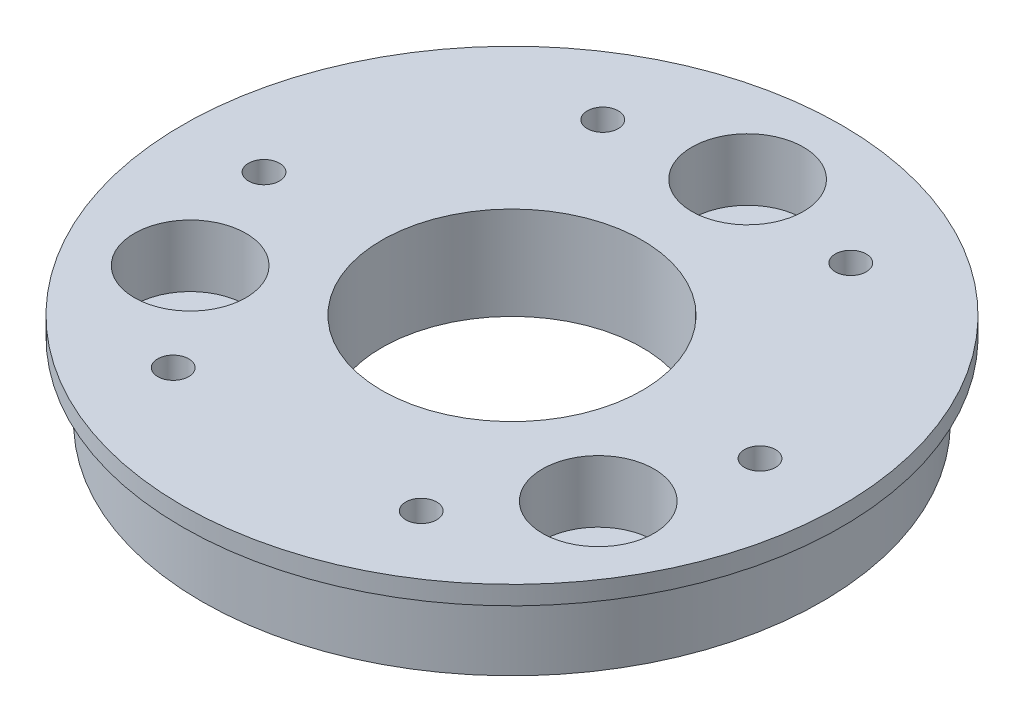
ISO-10303-21;
HEADER;
FILE_DESCRIPTION(('STEP AP214'),'2;1');
FILE_NAME('part.step','',(''),(''),'','','');
FILE_SCHEMA(('AUTOMOTIVE_DESIGN { 1 0 10303 214 1 1 1 1 }'));
ENDSEC;
DATA;
#1=APPLICATION_CONTEXT('core data for automotive mechanical design processes');
#2=APPLICATION_PROTOCOL_DEFINITION('international standard','automotive_design',2000,#1);
#3=PRODUCT_CONTEXT('',#1,'mechanical');
#4=PRODUCT('Part','Part','',(#3));
#5=PRODUCT_RELATED_PRODUCT_CATEGORY('part','',(#4));
#6=PRODUCT_DEFINITION_FORMATION('','',#4);
#7=PRODUCT_DEFINITION_CONTEXT('part definition',#1,'design');
#8=PRODUCT_DEFINITION('design','',#6,#7);
#9=PRODUCT_DEFINITION_SHAPE('','',#8);
#10=(LENGTH_UNIT() NAMED_UNIT(*) SI_UNIT(.MILLI.,.METRE.));
#11=(NAMED_UNIT(*) PLANE_ANGLE_UNIT() SI_UNIT($,.RADIAN.));
#12=(NAMED_UNIT(*) SI_UNIT($,.STERADIAN.) SOLID_ANGLE_UNIT());
#13=UNCERTAINTY_MEASURE_WITH_UNIT(LENGTH_MEASURE(1.E-05),#10,'distance_accuracy_value','');
#14=(GEOMETRIC_REPRESENTATION_CONTEXT(3) GLOBAL_UNCERTAINTY_ASSIGNED_CONTEXT((#13)) GLOBAL_UNIT_ASSIGNED_CONTEXT((#10,
#11,#12)) REPRESENTATION_CONTEXT('',''));
#15=CARTESIAN_POINT('',(0.,0.,0.));
#16=DIRECTION('',(0.,0.,1.));
#17=DIRECTION('',(1.,0.,0.));
#18=AXIS2_PLACEMENT_3D('',#15,#16,#17);
#19=CARTESIAN_POINT('',(16.4544826719043,0.,9.49999999999998));
#20=DIRECTION('',(0.,1.,0.));
#21=DIRECTION('',(0.,0.,1.));
#22=AXIS2_PLACEMENT_3D('',#19,#20,#21);
#23=CYLINDRICAL_SURFACE('',#22,2.5);
#24=CARTESIAN_POINT('',(16.4544826719043,0.,9.49999999999998));
#25=DIRECTION('',(0.,1.,0.));
#26=DIRECTION('',(0.,0.,1.));
#27=AXIS2_PLACEMENT_3D('',#24,#25,#26);
#28=CIRCLE('',#27,2.5);
#29=CARTESIAN_POINT('',(16.4544826719043,0.,12.));
#30=VERTEX_POINT('',#29);
#31=EDGE_CURVE('E139',#30,#30,#28,.T.);
#32=ORIENTED_EDGE('',*,*,#31,.F.);
#33=EDGE_LOOP('',(#32));
#34=FACE_BOUND('',#33,.T.);
#35=CARTESIAN_POINT('',(16.4544826719043,2.5,9.49999999999998));
#36=DIRECTION('',(0.,1.,0.));
#37=DIRECTION('',(0.,0.,1.));
#38=AXIS2_PLACEMENT_3D('',#35,#36,#37);
#39=CIRCLE('',#38,2.5);
#40=CARTESIAN_POINT('',(16.4544826719043,2.5,12.));
#41=VERTEX_POINT('',#40);
#42=EDGE_CURVE('E166',#41,#41,#39,.F.);
#43=ORIENTED_EDGE('',*,*,#42,.F.);
#44=EDGE_LOOP('',(#43));
#45=FACE_BOUND('',#44,.T.);
#46=ADVANCED_FACE('F44',(#34,#45),#23,.F.);
#47=CARTESIAN_POINT('',(-16.4544826719043,0.,9.49999999999998));
#48=DIRECTION('',(0.,1.,0.));
#49=DIRECTION('',(0.,0.,1.));
#50=AXIS2_PLACEMENT_3D('',#47,#48,#49);
#51=CYLINDRICAL_SURFACE('',#50,2.5);
#52=CARTESIAN_POINT('',(-16.4544826719043,0.,9.49999999999998));
#53=DIRECTION('',(0.,1.,0.));
#54=DIRECTION('',(0.,0.,1.));
#55=AXIS2_PLACEMENT_3D('',#52,#53,#54);
#56=CIRCLE('',#55,2.5);
#57=CARTESIAN_POINT('',(-16.4544826719043,0.,12.));
#58=VERTEX_POINT('',#57);
#59=EDGE_CURVE('E132',#58,#58,#56,.T.);
#60=ORIENTED_EDGE('',*,*,#59,.F.);
#61=EDGE_LOOP('',(#60));
#62=FACE_BOUND('',#61,.T.);
#63=CARTESIAN_POINT('',(-16.4544826719043,2.5,9.49999999999998));
#64=DIRECTION('',(0.,1.,0.));
#65=DIRECTION('',(0.,0.,1.));
#66=AXIS2_PLACEMENT_3D('',#63,#64,#65);
#67=CIRCLE('',#66,2.5);
#68=CARTESIAN_POINT('',(-16.4544826719043,2.5,12.));
#69=VERTEX_POINT('',#68);
#70=EDGE_CURVE('E161',#69,#69,#67,.F.);
#71=ORIENTED_EDGE('',*,*,#70,.F.);
#72=EDGE_LOOP('',(#71));
#73=FACE_BOUND('',#72,.T.);
#74=ADVANCED_FACE('F87',(#62,#73),#51,.F.);
#75=CARTESIAN_POINT('',(0.,0.,-19.));
#76=DIRECTION('',(0.,1.,0.));
#77=DIRECTION('',(0.,0.,1.));
#78=AXIS2_PLACEMENT_3D('',#75,#76,#77);
#79=CYLINDRICAL_SURFACE('',#78,2.5);
#80=CARTESIAN_POINT('',(0.,0.,-19.));
#81=DIRECTION('',(0.,1.,0.));
#82=DIRECTION('',(0.,0.,1.));
#83=AXIS2_PLACEMENT_3D('',#80,#81,#82);
#84=CIRCLE('',#83,2.5);
#85=CARTESIAN_POINT('',(0.,0.,-16.5));
#86=VERTEX_POINT('',#85);
#87=EDGE_CURVE('E124',#86,#86,#84,.T.);
#88=ORIENTED_EDGE('',*,*,#87,.F.);
#89=EDGE_LOOP('',(#88));
#90=FACE_BOUND('',#89,.T.);
#91=CARTESIAN_POINT('',(0.,2.5,-19.));
#92=DIRECTION('',(0.,1.,0.));
#93=DIRECTION('',(0.,0.,1.));
#94=AXIS2_PLACEMENT_3D('',#91,#92,#93);
#95=CIRCLE('',#94,2.5);
#96=CARTESIAN_POINT('',(0.,2.5,-16.5));
#97=VERTEX_POINT('',#96);
#98=EDGE_CURVE('E157',#97,#97,#95,.F.);
#99=ORIENTED_EDGE('',*,*,#98,.F.);
#100=EDGE_LOOP('',(#99));
#101=FACE_BOUND('',#100,.T.);
#102=ADVANCED_FACE('F93',(#90,#101),#79,.F.);
#103=CARTESIAN_POINT('',(20.,2.,0.));
#104=DIRECTION('',(0.,1.,0.));
#105=DIRECTION('',(0.,0.,1.));
#106=AXIS2_PLACEMENT_3D('',#103,#104,#105);
#107=CYLINDRICAL_SURFACE('',#106,1.25);
#108=CARTESIAN_POINT('',(20.,2.,0.));
#109=DIRECTION('',(0.,1.,0.));
#110=DIRECTION('',(0.,0.,1.));
#111=AXIS2_PLACEMENT_3D('',#108,#109,#110);
#112=CIRCLE('',#111,1.25);
#113=CARTESIAN_POINT('',(20.,2.,1.25));
#114=VERTEX_POINT('',#113);
#115=EDGE_CURVE('E264',#114,#114,#112,.T.);
#116=ORIENTED_EDGE('',*,*,#115,.F.);
#117=EDGE_LOOP('',(#116));
#118=FACE_BOUND('',#117,.T.);
#119=CARTESIAN_POINT('',(20.,7.5,0.));
#120=DIRECTION('',(0.,1.,0.));
#121=DIRECTION('',(0.,0.,1.));
#122=AXIS2_PLACEMENT_3D('',#119,#120,#121);
#123=CIRCLE('',#122,1.25);
#124=CARTESIAN_POINT('',(20.,7.5,1.25));
#125=VERTEX_POINT('',#124);
#126=EDGE_CURVE('E169',#125,#125,#123,.T.);
#127=ORIENTED_EDGE('',*,*,#126,.T.);
#128=EDGE_LOOP('',(#127));
#129=FACE_BOUND('',#128,.T.);
#130=ADVANCED_FACE('F351',(#118,#129),#107,.F.);
#131=CARTESIAN_POINT('',(20.,2.,0.));
#132=DIRECTION('',(0.,1.,0.));
#133=DIRECTION('',(0.,0.,1.));
#134=AXIS2_PLACEMENT_3D('',#131,#132,#133);
#135=PLANE('',#134);
#136=CARTESIAN_POINT('',(20.,2.,0.));
#137=DIRECTION('',(0.,1.,0.));
#138=DIRECTION('',(0.,0.,1.));
#139=AXIS2_PLACEMENT_3D('',#136,#137,#138);
#140=CIRCLE('',#139,0.417860258824741);
#141=CARTESIAN_POINT('',(20.,2.,0.417860258824741));
#142=VERTEX_POINT('',#141);
#143=EDGE_CURVE('E170',#142,#142,#140,.T.);
#144=ORIENTED_EDGE('',*,*,#143,.F.);
#145=EDGE_LOOP('',(#144));
#146=FACE_BOUND('',#145,.T.);
#147=ORIENTED_EDGE('',*,*,#115,.T.);
#148=EDGE_LOOP('',(#147));
#149=FACE_BOUND('',#148,.T.);
#150=ADVANCED_FACE('F353',(#146,#149),#135,.T.);
#151=CARTESIAN_POINT('',(0.,7.5,0.));
#152=DIRECTION('',(0.,-1.,0.));
#153=DIRECTION('',(0.,0.,-1.));
#154=AXIS2_PLACEMENT_3D('',#151,#152,#153);
#155=CYLINDRICAL_SURFACE('',#154,26.5766814637014);
#156=CARTESIAN_POINT('',(0.,7.5,0.));
#157=DIRECTION('',(0.,1.,0.));
#158=DIRECTION('',(0.,0.,1.));
#159=AXIS2_PLACEMENT_3D('',#156,#157,#158);
#160=CIRCLE('',#159,26.5766814637014);
#161=CARTESIAN_POINT('',(0.,7.5,26.5766814637014));
#162=VERTEX_POINT('',#161);
#163=EDGE_CURVE('E256',#162,#162,#160,.T.);
#164=ORIENTED_EDGE('',*,*,#163,.F.);
#165=EDGE_LOOP('',(#164));
#166=FACE_BOUND('',#165,.T.);
#167=CARTESIAN_POINT('',(0.,6.,0.));
#168=DIRECTION('',(0.,1.,0.));
#169=DIRECTION('',(0.,0.,1.));
#170=AXIS2_PLACEMENT_3D('',#167,#168,#169);
#171=CIRCLE('',#170,26.5766814637014);
#172=CARTESIAN_POINT('',(0.,6.,26.5766814637014));
#173=VERTEX_POINT('',#172);
#174=EDGE_CURVE('E255',#173,#173,#171,.T.);
#175=ORIENTED_EDGE('',*,*,#174,.T.);
#176=EDGE_LOOP('',(#175));
#177=FACE_BOUND('',#176,.T.);
#178=ADVANCED_FACE('F360',(#166,#177),#155,.T.);
#179=CARTESIAN_POINT('',(0.,6.,0.));
#180=DIRECTION('',(0.,1.,0.));
#181=DIRECTION('',(0.,0.,1.));
#182=AXIS2_PLACEMENT_3D('',#179,#180,#181);
#183=PLANE('',#182);
#184=CARTESIAN_POINT('',(0.,6.,0.));
#185=DIRECTION('',(0.,1.,0.));
#186=DIRECTION('',(0.,0.,1.));
#187=AXIS2_PLACEMENT_3D('',#184,#185,#186);
#188=CIRCLE('',#187,25.);
#189=CARTESIAN_POINT('',(0.,6.,25.));
#190=VERTEX_POINT('',#189);
#191=EDGE_CURVE('E11',#190,#190,#188,.T.);
#192=ORIENTED_EDGE('',*,*,#191,.T.);
#193=EDGE_LOOP('',(#192));
#194=FACE_BOUND('',#193,.T.);
#195=ORIENTED_EDGE('',*,*,#174,.F.);
#196=EDGE_LOOP('',(#195));
#197=FACE_BOUND('',#196,.T.);
#198=ADVANCED_FACE('F346',(#194,#197),#183,.F.);
#199=CARTESIAN_POINT('',(0.,7.5,0.));
#200=DIRECTION('',(0.,1.,0.));
#201=DIRECTION('',(0.,0.,1.));
#202=AXIS2_PLACEMENT_3D('',#199,#200,#201);
#203=PLANE('',#202);
#204=CARTESIAN_POINT('',(16.4544826719043,7.5,9.49999999999998));
#205=DIRECTION('',(0.,1.,0.));
#206=DIRECTION('',(0.,0.,1.));
#207=AXIS2_PLACEMENT_3D('',#204,#205,#206);
#208=CIRCLE('',#207,4.5);
#209=CARTESIAN_POINT('',(16.4544826719043,7.5,14.));
#210=VERTEX_POINT('',#209);
#211=EDGE_CURVE('E209',#210,#210,#208,.T.);
#212=ORIENTED_EDGE('',*,*,#211,.F.);
#213=EDGE_LOOP('',(#212));
#214=FACE_BOUND('',#213,.T.);
#215=CARTESIAN_POINT('',(-16.4544826719043,7.5,9.49999999999998));
#216=DIRECTION('',(0.,1.,0.));
#217=DIRECTION('',(0.,0.,1.));
#218=AXIS2_PLACEMENT_3D('',#215,#216,#217);
#219=CIRCLE('',#218,4.5);
#220=CARTESIAN_POINT('',(-16.4544826719043,7.5,14.));
#221=VERTEX_POINT('',#220);
#222=EDGE_CURVE('E217',#221,#221,#219,.T.);
#223=ORIENTED_EDGE('',*,*,#222,.F.);
#224=EDGE_LOOP('',(#223));
#225=FACE_BOUND('',#224,.T.);
#226=CARTESIAN_POINT('',(0.,7.5,-19.));
#227=DIRECTION('',(0.,1.,0.));
#228=DIRECTION('',(0.,0.,1.));
#229=AXIS2_PLACEMENT_3D('',#226,#227,#228);
#230=CIRCLE('',#229,4.5);
#231=CARTESIAN_POINT('',(0.,7.5,-14.5));
#232=VERTEX_POINT('',#231);
#233=EDGE_CURVE('E205',#232,#232,#230,.T.);
#234=ORIENTED_EDGE('',*,*,#233,.F.);
#235=EDGE_LOOP('',(#234));
#236=FACE_BOUND('',#235,.T.);
#237=CARTESIAN_POINT('',(9.99999999999999,7.5,-17.3205080756888));
#238=DIRECTION('',(0.,1.,0.));
#239=DIRECTION('',(0.,0.,1.));
#240=AXIS2_PLACEMENT_3D('',#237,#238,#239);
#241=CIRCLE('',#240,1.25);
#242=CARTESIAN_POINT('',(9.99999999999999,7.5,-16.0705080756888));
#243=VERTEX_POINT('',#242);
#244=EDGE_CURVE('E231',#243,#243,#241,.T.);
#245=ORIENTED_EDGE('',*,*,#244,.F.);
#246=EDGE_LOOP('',(#245));
#247=FACE_BOUND('',#246,.T.);
#248=CARTESIAN_POINT('',(-20.,7.5,0.));
#249=DIRECTION('',(0.,1.,0.));
#250=DIRECTION('',(0.,0.,1.));
#251=AXIS2_PLACEMENT_3D('',#248,#249,#250);
#252=CIRCLE('',#251,1.25);
#253=CARTESIAN_POINT('',(-20.,7.5,1.25));
#254=VERTEX_POINT('',#253);
#255=EDGE_CURVE('E239',#254,#254,#252,.T.);
#256=ORIENTED_EDGE('',*,*,#255,.F.);
#257=EDGE_LOOP('',(#256));
#258=FACE_BOUND('',#257,.T.);
#259=CARTESIAN_POINT('',(10.,7.5,17.3205080756888));
#260=DIRECTION('',(0.,1.,0.));
#261=DIRECTION('',(0.,0.,1.));
#262=AXIS2_PLACEMENT_3D('',#259,#260,#261);
#263=CIRCLE('',#262,1.25);
#264=CARTESIAN_POINT('',(10.,7.5,18.5705080756888));
#265=VERTEX_POINT('',#264);
#266=EDGE_CURVE('E247',#265,#265,#263,.T.);
#267=ORIENTED_EDGE('',*,*,#266,.F.);
#268=EDGE_LOOP('',(#267));
#269=FACE_BOUND('',#268,.T.);
#270=ORIENTED_EDGE('',*,*,#163,.T.);
#271=EDGE_LOOP('',(#270));
#272=FACE_BOUND('',#271,.T.);
#273=CARTESIAN_POINT('',(0.,7.5,0.));
#274=DIRECTION('',(0.,1.,0.));
#275=DIRECTION('',(0.,0.,1.));
#276=AXIS2_PLACEMENT_3D('',#273,#274,#275);
#277=CIRCLE('',#276,10.5);
#278=CARTESIAN_POINT('',(0.,7.5,10.5));
#279=VERTEX_POINT('',#278);
#280=EDGE_CURVE('E251',#279,#279,#277,.T.);
#281=ORIENTED_EDGE('',*,*,#280,.F.);
#282=EDGE_LOOP('',(#281));
#283=FACE_BOUND('',#282,.T.);
#284=CARTESIAN_POINT('',(-10.,7.5,17.3205080756888));
#285=DIRECTION('',(0.,1.,0.));
#286=DIRECTION('',(0.,0.,1.));
#287=AXIS2_PLACEMENT_3D('',#284,#285,#286);
#288=CIRCLE('',#287,1.25);
#289=CARTESIAN_POINT('',(-10.,7.5,18.5705080756888));
#290=VERTEX_POINT('',#289);
#291=EDGE_CURVE('E243',#290,#290,#288,.T.);
#292=ORIENTED_EDGE('',*,*,#291,.F.);
#293=EDGE_LOOP('',(#292));
#294=FACE_BOUND('',#293,.T.);
#295=CARTESIAN_POINT('',(-10.,7.5,-17.3205080756888));
#296=DIRECTION('',(0.,1.,0.));
#297=DIRECTION('',(0.,0.,1.));
#298=AXIS2_PLACEMENT_3D('',#295,#296,#297);
#299=CIRCLE('',#298,1.25);
#300=CARTESIAN_POINT('',(-10.,7.5,-16.0705080756888));
#301=VERTEX_POINT('',#300);
#302=EDGE_CURVE('E235',#301,#301,#299,.T.);
#303=ORIENTED_EDGE('',*,*,#302,.F.);
#304=EDGE_LOOP('',(#303));
#305=FACE_BOUND('',#304,.T.);
#306=ORIENTED_EDGE('',*,*,#126,.F.);
#307=EDGE_LOOP('',(#306));
#308=FACE_BOUND('',#307,.T.);
#309=ADVANCED_FACE('F109',(#214,#225,#236,#247,#258,#269,#272,#283,#294,#305,#308),#203,.T.);
#310=CARTESIAN_POINT('',(0.,-0.00100000000000013,0.));
#311=DIRECTION('',(0.,1.,0.));
#312=DIRECTION('',(0.,0.,1.));
#313=AXIS2_PLACEMENT_3D('',#310,#311,#312);
#314=CYLINDRICAL_SURFACE('',#313,10.5);
#315=CARTESIAN_POINT('',(0.,0.,0.));
#316=DIRECTION('',(0.,1.,0.));
#317=DIRECTION('',(0.,0.,1.));
#318=AXIS2_PLACEMENT_3D('',#315,#316,#317);
#319=CIRCLE('',#318,10.5);
#320=CARTESIAN_POINT('',(0.,0.,10.5));
#321=VERTEX_POINT('',#320);
#322=EDGE_CURVE('E147',#321,#321,#319,.F.);
#323=CARTESIAN_POINT('',(0.,0.,10.5));
#324=CARTESIAN_POINT('',(0.,0.078125,10.5));
#325=CARTESIAN_POINT('',(0.,0.15625,10.5));
#326=CARTESIAN_POINT('',(0.,0.3125,10.5));
#327=CARTESIAN_POINT('',(0.,0.390625,10.5));
#328=CARTESIAN_POINT('',(0.,0.546875,10.5));
#329=CARTESIAN_POINT('',(0.,0.625,10.5));
#330=CARTESIAN_POINT('',(0.,0.78125,10.5));
#331=CARTESIAN_POINT('',(0.,0.859375,10.5));
#332=CARTESIAN_POINT('',(0.,1.015625,10.5));
#333=CARTESIAN_POINT('',(0.,1.09375,10.5));
#334=CARTESIAN_POINT('',(0.,1.25,10.5));
#335=CARTESIAN_POINT('',(0.,1.328125,10.5));
#336=CARTESIAN_POINT('',(0.,1.484375,10.5));
#337=CARTESIAN_POINT('',(0.,1.5625,10.5));
#338=CARTESIAN_POINT('',(0.,1.71875,10.5));
#339=CARTESIAN_POINT('',(0.,1.796875,10.5));
#340=CARTESIAN_POINT('',(0.,1.953125,10.5));
#341=CARTESIAN_POINT('',(0.,2.03125,10.5));
#342=CARTESIAN_POINT('',(0.,2.1875,10.5));
#343=CARTESIAN_POINT('',(0.,2.265625,10.5));
#344=CARTESIAN_POINT('',(0.,2.421875,10.5));
#345=CARTESIAN_POINT('',(0.,2.5,10.5));
#346=CARTESIAN_POINT('',(0.,2.65625,10.5));
#347=CARTESIAN_POINT('',(0.,2.734375,10.5));
#348=CARTESIAN_POINT('',(0.,2.890625,10.5));
#349=CARTESIAN_POINT('',(0.,2.96875,10.5));
#350=CARTESIAN_POINT('',(0.,3.125,10.5));
#351=CARTESIAN_POINT('',(0.,3.203125,10.5));
#352=CARTESIAN_POINT('',(0.,3.359375,10.5));
#353=CARTESIAN_POINT('',(0.,3.4375,10.5));
#354=CARTESIAN_POINT('',(0.,3.59375,10.5));
#355=CARTESIAN_POINT('',(0.,3.671875,10.5));
#356=CARTESIAN_POINT('',(0.,3.828125,10.5));
#357=CARTESIAN_POINT('',(0.,3.90625,10.5));
#358=CARTESIAN_POINT('',(0.,4.0625,10.5));
#359=CARTESIAN_POINT('',(0.,4.140625,10.5));
#360=CARTESIAN_POINT('',(0.,4.296875,10.5));
#361=CARTESIAN_POINT('',(0.,4.375,10.5));
#362=CARTESIAN_POINT('',(0.,4.53125,10.5));
#363=CARTESIAN_POINT('',(0.,4.609375,10.5));
#364=CARTESIAN_POINT('',(0.,4.765625,10.5));
#365=CARTESIAN_POINT('',(0.,4.84375,10.5));
#366=CARTESIAN_POINT('',(0.,5.,10.5));
#367=CARTESIAN_POINT('',(0.,5.078125,10.5));
#368=CARTESIAN_POINT('',(0.,5.234375,10.5));
#369=CARTESIAN_POINT('',(0.,5.3125,10.5));
#370=CARTESIAN_POINT('',(0.,5.46875,10.5));
#371=CARTESIAN_POINT('',(0.,5.546875,10.5));
#372=CARTESIAN_POINT('',(0.,5.703125,10.5));
#373=CARTESIAN_POINT('',(0.,5.78125,10.5));
#374=CARTESIAN_POINT('',(0.,5.9375,10.5));
#375=CARTESIAN_POINT('',(0.,6.015625,10.5));
#376=CARTESIAN_POINT('',(0.,6.171875,10.5));
#377=CARTESIAN_POINT('',(0.,6.25,10.5));
#378=CARTESIAN_POINT('',(0.,6.40625,10.5));
#379=CARTESIAN_POINT('',(0.,6.484375,10.5));
#380=CARTESIAN_POINT('',(0.,6.640625,10.5));
#381=CARTESIAN_POINT('',(0.,6.71875,10.5));
#382=CARTESIAN_POINT('',(0.,6.875,10.5));
#383=CARTESIAN_POINT('',(0.,6.953125,10.5));
#384=CARTESIAN_POINT('',(0.,7.109375,10.5));
#385=CARTESIAN_POINT('',(0.,7.1875,10.5));
#386=CARTESIAN_POINT('',(0.,7.34375,10.5));
#387=CARTESIAN_POINT('',(0.,7.421875,10.5));
#388=CARTESIAN_POINT('',(0.,7.5,10.5));
#389=B_SPLINE_CURVE_WITH_KNOTS('',3,(#323,#324,#325,#326,#327,#328,#329,#330,#331,#332,#333,
#334,#335,#336,#337,#338,#339,#340,#341,#342,#343,#344,#345,#346,#347,#348,#349,#350,#351,#352,
#353,#354,#355,#356,#357,#358,#359,#360,#361,#362,#363,#364,#365,#366,#367,#368,#369,#370,#371,
#372,#373,#374,#375,#376,#377,#378,#379,#380,#381,#382,#383,#384,#385,#386,#387,#388),
.UNSPECIFIED.,.F.,.F.,(4,2,2,2,2,2,2,2,2,2,2,2,2,2,2,2,2,2,2,2,2,2,2,2,2,2,2,2,2,2,2,2,4),(0.,
0.234375,0.46875,0.703125,0.9375,1.171875,1.40625,1.640625,1.875,2.109375,2.34375,2.578125,
2.8125,3.046875,3.28125,3.515625,3.75,3.984375,4.21875,4.453125,4.6875,4.921875,5.15625,
5.390625,5.625,5.859375,6.09375,6.328125,6.5625,6.796875,7.03125,7.265625,7.5),.UNSPECIFIED.);
#390=EDGE_CURVE('BSEAM107',#321,#279,#389,.T.);
#391=ORIENTED_EDGE('',*,*,#322,.T.);
#392=ORIENTED_EDGE('',*,*,#280,.T.);
#393=ORIENTED_EDGE('',*,*,#390,.T.);
#394=ORIENTED_EDGE('',*,*,#390,.F.);
#395=EDGE_LOOP('',(#391,#393,#392,#394));
#396=FACE_BOUND('',#395,.T.);
#397=ADVANCED_FACE('F107',(#396),#314,.F.);
#398=CARTESIAN_POINT('',(16.4544826719043,0.,-9.50000000000002));
#399=DIRECTION('',(0.,1.,0.));
#400=DIRECTION('',(0.,0.,1.));
#401=AXIS2_PLACEMENT_3D('',#398,#399,#400);
#402=CYLINDRICAL_SURFACE('',#401,2.5);
#403=CARTESIAN_POINT('',(16.4544826719043,3.,-9.50000000000002));
#404=DIRECTION('',(0.,-1.,0.));
#405=DIRECTION('',(0.,0.,-1.));
#406=AXIS2_PLACEMENT_3D('',#403,#404,#405);
#407=CIRCLE('',#406,2.5);
#408=CARTESIAN_POINT('',(16.4544826719043,3.,-12.));
#409=VERTEX_POINT('',#408);
#410=EDGE_CURVE('E197',#409,#409,#407,.T.);
#411=ORIENTED_EDGE('',*,*,#410,.F.);
#412=EDGE_LOOP('',(#411));
#413=FACE_BOUND('',#412,.T.);
#414=CARTESIAN_POINT('',(16.4544826719043,0.,-9.50000000000002));
#415=DIRECTION('',(0.,1.,0.));
#416=DIRECTION('',(0.,0.,1.));
#417=AXIS2_PLACEMENT_3D('',#414,#415,#416);
#418=CIRCLE('',#417,2.5);
#419=CARTESIAN_POINT('',(16.4544826719043,0.,-7.00000000000002));
#420=VERTEX_POINT('',#419);
#421=EDGE_CURVE('E143',#420,#420,#418,.T.);
#422=ORIENTED_EDGE('',*,*,#421,.F.);
#423=EDGE_LOOP('',(#422));
#424=FACE_BOUND('',#423,.T.);
#425=ADVANCED_FACE('F100',(#413,#424),#402,.F.);
#426=CARTESIAN_POINT('',(0.,0.,19.));
#427=DIRECTION('',(0.,1.,0.));
#428=DIRECTION('',(0.,0.,1.));
#429=AXIS2_PLACEMENT_3D('',#426,#427,#428);
#430=CYLINDRICAL_SURFACE('',#429,2.5);
#431=CARTESIAN_POINT('',(0.,3.,19.));
#432=DIRECTION('',(0.,-1.,0.));
#433=DIRECTION('',(0.,0.,-1.));
#434=AXIS2_PLACEMENT_3D('',#431,#432,#433);
#435=CIRCLE('',#434,2.5);
#436=CARTESIAN_POINT('',(0.,3.,16.5));
#437=VERTEX_POINT('',#436);
#438=EDGE_CURVE('E201',#437,#437,#435,.T.);
#439=ORIENTED_EDGE('',*,*,#438,.F.);
#440=EDGE_LOOP('',(#439));
#441=FACE_BOUND('',#440,.T.);
#442=CARTESIAN_POINT('',(0.,0.,19.));
#443=DIRECTION('',(0.,1.,0.));
#444=DIRECTION('',(0.,0.,1.));
#445=AXIS2_PLACEMENT_3D('',#442,#443,#444);
#446=CIRCLE('',#445,2.5);
#447=CARTESIAN_POINT('',(0.,0.,21.5));
#448=VERTEX_POINT('',#447);
#449=EDGE_CURVE('E136',#448,#448,#446,.T.);
#450=ORIENTED_EDGE('',*,*,#449,.F.);
#451=EDGE_LOOP('',(#450));
#452=FACE_BOUND('',#451,.T.);
#453=ADVANCED_FACE('F102',(#441,#452),#430,.F.);
#454=CARTESIAN_POINT('',(-16.4544826719043,0.,-9.50000000000001));
#455=DIRECTION('',(0.,1.,0.));
#456=DIRECTION('',(0.,0.,1.));
#457=AXIS2_PLACEMENT_3D('',#454,#455,#456);
#458=CYLINDRICAL_SURFACE('',#457,2.5);
#459=CARTESIAN_POINT('',(-16.4544826719043,3.,-9.50000000000001));
#460=DIRECTION('',(0.,-1.,0.));
#461=DIRECTION('',(0.,0.,-1.));
#462=AXIS2_PLACEMENT_3D('',#459,#460,#461);
#463=CIRCLE('',#462,2.5);
#464=CARTESIAN_POINT('',(-16.4544826719043,3.,-12.));
#465=VERTEX_POINT('',#464);
#466=EDGE_CURVE('E181',#465,#465,#463,.T.);
#467=ORIENTED_EDGE('',*,*,#466,.F.);
#468=EDGE_LOOP('',(#467));
#469=FACE_BOUND('',#468,.T.);
#470=CARTESIAN_POINT('',(-16.4544826719043,0.,-9.50000000000001));
#471=DIRECTION('',(0.,1.,0.));
#472=DIRECTION('',(0.,0.,1.));
#473=AXIS2_PLACEMENT_3D('',#470,#471,#472);
#474=CIRCLE('',#473,2.5);
#475=CARTESIAN_POINT('',(-16.4544826719043,0.,-7.00000000000001));
#476=VERTEX_POINT('',#475);
#477=EDGE_CURVE('E128',#476,#476,#474,.T.);
#478=ORIENTED_EDGE('',*,*,#477,.F.);
#479=EDGE_LOOP('',(#478));
#480=FACE_BOUND('',#479,.T.);
#481=ADVANCED_FACE('F104',(#469,#480),#458,.F.);
#482=CARTESIAN_POINT('',(0.,0.,0.));
#483=DIRECTION('',(0.,1.,0.));
#484=DIRECTION('',(0.,0.,1.));
#485=AXIS2_PLACEMENT_3D('',#482,#483,#484);
#486=PLANE('',#485);
#487=ORIENTED_EDGE('',*,*,#87,.T.);
#488=EDGE_LOOP('',(#487));
#489=FACE_BOUND('',#488,.T.);
#490=ORIENTED_EDGE('',*,*,#477,.T.);
#491=EDGE_LOOP('',(#490));
#492=FACE_BOUND('',#491,.T.);
#493=ORIENTED_EDGE('',*,*,#59,.T.);
#494=EDGE_LOOP('',(#493));
#495=FACE_BOUND('',#494,.T.);
#496=ORIENTED_EDGE('',*,*,#449,.T.);
#497=EDGE_LOOP('',(#496));
#498=FACE_BOUND('',#497,.T.);
#499=ORIENTED_EDGE('',*,*,#31,.T.);
#500=EDGE_LOOP('',(#499));
#501=FACE_BOUND('',#500,.T.);
#502=ORIENTED_EDGE('',*,*,#421,.T.);
#503=EDGE_LOOP('',(#502));
#504=FACE_BOUND('',#503,.T.);
#505=ORIENTED_EDGE('',*,*,#322,.F.);
#506=EDGE_LOOP('',(#505));
#507=FACE_BOUND('',#506,.T.);
#508=CARTESIAN_POINT('',(0.,0.,0.));
#509=DIRECTION('',(0.,1.,0.));
#510=DIRECTION('',(0.,0.,1.));
#511=AXIS2_PLACEMENT_3D('',#508,#509,#510);
#512=CIRCLE('',#511,25.);
#513=CARTESIAN_POINT('',(0.,0.,25.));
#514=VERTEX_POINT('',#513);
#515=EDGE_CURVE('E54',#514,#514,#512,.T.);
#516=ORIENTED_EDGE('',*,*,#515,.F.);
#517=EDGE_LOOP('',(#516));
#518=FACE_BOUND('',#517,.T.);
#519=ADVANCED_FACE('F111',(#489,#492,#495,#498,#501,#504,#507,#518),#486,.F.);
#520=CARTESIAN_POINT('',(0.,6.,0.));
#521=DIRECTION('',(0.,-1.,0.));
#522=DIRECTION('',(0.,0.,-1.));
#523=AXIS2_PLACEMENT_3D('',#520,#521,#522);
#524=CYLINDRICAL_SURFACE('',#523,25.);
#525=ORIENTED_EDGE('',*,*,#191,.F.);
#526=EDGE_LOOP('',(#525));
#527=FACE_BOUND('',#526,.T.);
#528=ORIENTED_EDGE('',*,*,#515,.T.);
#529=EDGE_LOOP('',(#528));
#530=FACE_BOUND('',#529,.T.);
#531=ADVANCED_FACE('F46',(#527,#530),#524,.T.);
#532=CARTESIAN_POINT('',(10.,2.,17.3205080756888));
#533=DIRECTION('',(0.,1.,0.));
#534=DIRECTION('',(0.,0.,1.));
#535=AXIS2_PLACEMENT_3D('',#532,#533,#534);
#536=PLANE('',#535);
#537=CARTESIAN_POINT('',(10.,2.,17.3205080756888));
#538=DIRECTION('',(0.,1.,0.));
#539=DIRECTION('',(0.,0.,1.));
#540=AXIS2_PLACEMENT_3D('',#537,#538,#539);
#541=CIRCLE('',#540,0.417860258824743);
#542=CARTESIAN_POINT('',(10.,2.,17.7383683345135));
#543=VERTEX_POINT('',#542);
#544=EDGE_CURVE('E173',#543,#543,#541,.T.);
#545=ORIENTED_EDGE('',*,*,#544,.F.);
#546=EDGE_LOOP('',(#545));
#547=FACE_BOUND('',#546,.T.);
#548=CARTESIAN_POINT('',(10.,2.,17.3205080756888));
#549=DIRECTION('',(0.,1.,0.));
#550=DIRECTION('',(0.,0.,1.));
#551=AXIS2_PLACEMENT_3D('',#548,#549,#550);
#552=CIRCLE('',#551,1.25);
#553=CARTESIAN_POINT('',(10.,2.,18.5705080756888));
#554=VERTEX_POINT('',#553);
#555=EDGE_CURVE('E268',#554,#554,#552,.T.);
#556=ORIENTED_EDGE('',*,*,#555,.T.);
#557=EDGE_LOOP('',(#556));
#558=FACE_BOUND('',#557,.T.);
#559=ADVANCED_FACE('F118',(#547,#558),#536,.T.);
#560=CARTESIAN_POINT('',(10.,2.,17.3205080756888));
#561=DIRECTION('',(0.,1.,0.));
#562=DIRECTION('',(0.,0.,1.));
#563=AXIS2_PLACEMENT_3D('',#560,#561,#562);
#564=CYLINDRICAL_SURFACE('',#563,1.25);
#565=ORIENTED_EDGE('',*,*,#555,.F.);
#566=EDGE_LOOP('',(#565));
#567=FACE_BOUND('',#566,.T.);
#568=ORIENTED_EDGE('',*,*,#266,.T.);
#569=EDGE_LOOP('',(#568));
#570=FACE_BOUND('',#569,.T.);
#571=ADVANCED_FACE('F378',(#567,#570),#564,.F.);
#572=CARTESIAN_POINT('',(-10.,2.,17.3205080756888));
#573=DIRECTION('',(0.,1.,0.));
#574=DIRECTION('',(0.,0.,1.));
#575=AXIS2_PLACEMENT_3D('',#572,#573,#574);
#576=PLANE('',#575);
#577=CARTESIAN_POINT('',(-10.,2.,17.3205080756888));
#578=DIRECTION('',(0.,1.,0.));
#579=DIRECTION('',(0.,0.,1.));
#580=AXIS2_PLACEMENT_3D('',#577,#578,#579);
#581=CIRCLE('',#580,0.417860258824743);
#582=CARTESIAN_POINT('',(-10.,2.,17.7383683345135));
#583=VERTEX_POINT('',#582);
#584=EDGE_CURVE('E184',#583,#583,#581,.T.);
#585=ORIENTED_EDGE('',*,*,#584,.F.);
#586=EDGE_LOOP('',(#585));
#587=FACE_BOUND('',#586,.T.);
#588=CARTESIAN_POINT('',(-10.,2.,17.3205080756888));
#589=DIRECTION('',(0.,1.,0.));
#590=DIRECTION('',(0.,0.,1.));
#591=AXIS2_PLACEMENT_3D('',#588,#589,#590);
#592=CIRCLE('',#591,1.25);
#593=CARTESIAN_POINT('',(-10.,2.,18.5705080756888));
#594=VERTEX_POINT('',#593);
#595=EDGE_CURVE('E276',#594,#594,#592,.T.);
#596=ORIENTED_EDGE('',*,*,#595,.T.);
#597=EDGE_LOOP('',(#596));
#598=FACE_BOUND('',#597,.T.);
#599=ADVANCED_FACE('F382',(#587,#598),#576,.T.);
#600=CARTESIAN_POINT('',(-10.,2.,17.3205080756888));
#601=DIRECTION('',(0.,1.,0.));
#602=DIRECTION('',(0.,0.,1.));
#603=AXIS2_PLACEMENT_3D('',#600,#601,#602);
#604=CYLINDRICAL_SURFACE('',#603,1.25);
#605=ORIENTED_EDGE('',*,*,#595,.F.);
#606=EDGE_LOOP('',(#605));
#607=FACE_BOUND('',#606,.T.);
#608=ORIENTED_EDGE('',*,*,#291,.T.);
#609=EDGE_LOOP('',(#608));
#610=FACE_BOUND('',#609,.T.);
#611=ADVANCED_FACE('F386',(#607,#610),#604,.F.);
#612=CARTESIAN_POINT('',(-20.,2.,0.));
#613=DIRECTION('',(0.,1.,0.));
#614=DIRECTION('',(0.,0.,1.));
#615=AXIS2_PLACEMENT_3D('',#612,#613,#614);
#616=PLANE('',#615);
#617=CARTESIAN_POINT('',(-20.,2.,0.));
#618=DIRECTION('',(0.,1.,0.));
#619=DIRECTION('',(0.,0.,1.));
#620=AXIS2_PLACEMENT_3D('',#617,#618,#619);
#621=CIRCLE('',#620,0.417860258824741);
#622=CARTESIAN_POINT('',(-20.,2.,0.417860258824744));
#623=VERTEX_POINT('',#622);
#624=EDGE_CURVE('E48',#623,#623,#621,.T.);
#625=ORIENTED_EDGE('',*,*,#624,.F.);
#626=EDGE_LOOP('',(#625));
#627=FACE_BOUND('',#626,.T.);
#628=CARTESIAN_POINT('',(-20.,2.,0.));
#629=DIRECTION('',(0.,1.,0.));
#630=DIRECTION('',(0.,0.,1.));
#631=AXIS2_PLACEMENT_3D('',#628,#629,#630);
#632=CIRCLE('',#631,1.25);
#633=CARTESIAN_POINT('',(-20.,2.,1.25));
#634=VERTEX_POINT('',#633);
#635=EDGE_CURVE('E280',#634,#634,#632,.T.);
#636=ORIENTED_EDGE('',*,*,#635,.T.);
#637=EDGE_LOOP('',(#636));
#638=FACE_BOUND('',#637,.T.);
#639=ADVANCED_FACE('F390',(#627,#638),#616,.T.);
#640=CARTESIAN_POINT('',(-20.,2.,0.));
#641=DIRECTION('',(0.,1.,0.));
#642=DIRECTION('',(0.,0.,1.));
#643=AXIS2_PLACEMENT_3D('',#640,#641,#642);
#644=CYLINDRICAL_SURFACE('',#643,1.25);
#645=ORIENTED_EDGE('',*,*,#635,.F.);
#646=EDGE_LOOP('',(#645));
#647=FACE_BOUND('',#646,.T.);
#648=ORIENTED_EDGE('',*,*,#255,.T.);
#649=EDGE_LOOP('',(#648));
#650=FACE_BOUND('',#649,.T.);
#651=ADVANCED_FACE('F394',(#647,#650),#644,.F.);
#652=CARTESIAN_POINT('',(-10.,2.,-17.3205080756888));
#653=DIRECTION('',(0.,1.,0.));
#654=DIRECTION('',(0.,0.,1.));
#655=AXIS2_PLACEMENT_3D('',#652,#653,#654);
#656=PLANE('',#655);
#657=CARTESIAN_POINT('',(-10.,2.,-17.3205080756888));
#658=DIRECTION('',(0.,1.,0.));
#659=DIRECTION('',(0.,0.,1.));
#660=AXIS2_PLACEMENT_3D('',#657,#658,#659);
#661=CIRCLE('',#660,0.417860258824743);
#662=CARTESIAN_POINT('',(-10.,2.,-16.902647816864));
#663=VERTEX_POINT('',#662);
#664=EDGE_CURVE('E404',#663,#663,#661,.T.);
#665=ORIENTED_EDGE('',*,*,#664,.F.);
#666=EDGE_LOOP('',(#665));
#667=FACE_BOUND('',#666,.T.);
#668=CARTESIAN_POINT('',(-10.,2.,-17.3205080756888));
#669=DIRECTION('',(0.,1.,0.));
#670=DIRECTION('',(0.,0.,1.));
#671=AXIS2_PLACEMENT_3D('',#668,#669,#670);
#672=CIRCLE('',#671,1.25);
#673=CARTESIAN_POINT('',(-10.,2.,-16.0705080756888));
#674=VERTEX_POINT('',#673);
#675=EDGE_CURVE('E272',#674,#674,#672,.T.);
#676=ORIENTED_EDGE('',*,*,#675,.T.);
#677=EDGE_LOOP('',(#676));
#678=FACE_BOUND('',#677,.T.);
#679=ADVANCED_FACE('F335',(#667,#678),#656,.T.);
#680=CARTESIAN_POINT('',(-10.,2.,-17.3205080756888));
#681=DIRECTION('',(0.,1.,0.));
#682=DIRECTION('',(0.,0.,1.));
#683=AXIS2_PLACEMENT_3D('',#680,#681,#682);
#684=CYLINDRICAL_SURFACE('',#683,1.25);
#685=ORIENTED_EDGE('',*,*,#675,.F.);
#686=EDGE_LOOP('',(#685));
#687=FACE_BOUND('',#686,.T.);
#688=ORIENTED_EDGE('',*,*,#302,.T.);
#689=EDGE_LOOP('',(#688));
#690=FACE_BOUND('',#689,.T.);
#691=ADVANCED_FACE('F337',(#687,#690),#684,.F.);
#692=CARTESIAN_POINT('',(9.99999999999999,2.,-17.3205080756888));
#693=DIRECTION('',(0.,1.,0.));
#694=DIRECTION('',(0.,0.,1.));
#695=AXIS2_PLACEMENT_3D('',#692,#693,#694);
#696=PLANE('',#695);
#697=CARTESIAN_POINT('',(9.99999999999999,2.,-17.3205080756888));
#698=DIRECTION('',(0.,1.,0.));
#699=DIRECTION('',(0.,0.,1.));
#700=AXIS2_PLACEMENT_3D('',#697,#698,#699);
#701=CIRCLE('',#700,0.417860258824743);
#702=CARTESIAN_POINT('',(9.99999999999999,2.,-16.902647816864));
#703=VERTEX_POINT('',#702);
#704=EDGE_CURVE('E174',#703,#703,#701,.T.);
#705=ORIENTED_EDGE('',*,*,#704,.F.);
#706=EDGE_LOOP('',(#705));
#707=FACE_BOUND('',#706,.T.);
#708=CARTESIAN_POINT('',(9.99999999999999,2.,-17.3205080756888));
#709=DIRECTION('',(0.,1.,0.));
#710=DIRECTION('',(0.,0.,1.));
#711=AXIS2_PLACEMENT_3D('',#708,#709,#710);
#712=CIRCLE('',#711,1.25);
#713=CARTESIAN_POINT('',(9.99999999999999,2.,-16.0705080756888));
#714=VERTEX_POINT('',#713);
#715=EDGE_CURVE('E260',#714,#714,#712,.T.);
#716=ORIENTED_EDGE('',*,*,#715,.T.);
#717=EDGE_LOOP('',(#716));
#718=FACE_BOUND('',#717,.T.);
#719=ADVANCED_FACE('F340',(#707,#718),#696,.T.);
#720=CARTESIAN_POINT('',(9.99999999999999,2.,-17.3205080756888));
#721=DIRECTION('',(0.,1.,0.));
#722=DIRECTION('',(0.,0.,1.));
#723=AXIS2_PLACEMENT_3D('',#720,#721,#722);
#724=CYLINDRICAL_SURFACE('',#723,1.25);
#725=ORIENTED_EDGE('',*,*,#715,.F.);
#726=EDGE_LOOP('',(#725));
#727=FACE_BOUND('',#726,.T.);
#728=ORIENTED_EDGE('',*,*,#244,.T.);
#729=EDGE_LOOP('',(#728));
#730=FACE_BOUND('',#729,.T.);
#731=ADVANCED_FACE('F370',(#727,#730),#724,.F.);
#732=CARTESIAN_POINT('',(0.,2.5,-19.));
#733=DIRECTION('',(0.,1.,0.));
#734=DIRECTION('',(0.,0.,1.));
#735=AXIS2_PLACEMENT_3D('',#732,#733,#734);
#736=PLANE('',#735);
#737=CARTESIAN_POINT('',(0.,2.5,-19.));
#738=DIRECTION('',(0.,1.,0.));
#739=DIRECTION('',(0.,0.,1.));
#740=AXIS2_PLACEMENT_3D('',#737,#738,#739);
#741=CIRCLE('',#740,4.5);
#742=CARTESIAN_POINT('',(0.,2.5,-14.5));
#743=VERTEX_POINT('',#742);
#744=EDGE_CURVE('E221',#743,#743,#741,.T.);
#745=ORIENTED_EDGE('',*,*,#744,.T.);
#746=EDGE_LOOP('',(#745));
#747=FACE_BOUND('',#746,.T.);
#748=ORIENTED_EDGE('',*,*,#98,.T.);
#749=EDGE_LOOP('',(#748));
#750=FACE_BOUND('',#749,.T.);
#751=ADVANCED_FACE('F374',(#747,#750),#736,.T.);
#752=CARTESIAN_POINT('',(0.,2.5,-19.));
#753=DIRECTION('',(0.,1.,0.));
#754=DIRECTION('',(0.,0.,1.));
#755=AXIS2_PLACEMENT_3D('',#752,#753,#754);
#756=CYLINDRICAL_SURFACE('',#755,4.5);
#757=ORIENTED_EDGE('',*,*,#744,.F.);
#758=EDGE_LOOP('',(#757));
#759=FACE_BOUND('',#758,.T.);
#760=ORIENTED_EDGE('',*,*,#233,.T.);
#761=EDGE_LOOP('',(#760));
#762=FACE_BOUND('',#761,.T.);
#763=ADVANCED_FACE('F438',(#759,#762),#756,.F.);
#764=CARTESIAN_POINT('',(-16.4544826719043,2.5,9.49999999999998));
#765=DIRECTION('',(0.,1.,0.));
#766=DIRECTION('',(0.,0.,1.));
#767=AXIS2_PLACEMENT_3D('',#764,#765,#766);
#768=PLANE('',#767);
#769=CARTESIAN_POINT('',(-16.4544826719043,2.5,9.49999999999998));
#770=DIRECTION('',(0.,1.,0.));
#771=DIRECTION('',(0.,0.,1.));
#772=AXIS2_PLACEMENT_3D('',#769,#770,#771);
#773=CIRCLE('',#772,4.5);
#774=CARTESIAN_POINT('',(-16.4544826719043,2.5,14.));
#775=VERTEX_POINT('',#774);
#776=EDGE_CURVE('E213',#775,#775,#773,.T.);
#777=ORIENTED_EDGE('',*,*,#776,.T.);
#778=EDGE_LOOP('',(#777));
#779=FACE_BOUND('',#778,.T.);
#780=ORIENTED_EDGE('',*,*,#70,.T.);
#781=EDGE_LOOP('',(#780));
#782=FACE_BOUND('',#781,.T.);
#783=ADVANCED_FACE('F441',(#779,#782),#768,.T.);
#784=CARTESIAN_POINT('',(-16.4544826719043,2.5,9.49999999999998));
#785=DIRECTION('',(0.,1.,0.));
#786=DIRECTION('',(0.,0.,1.));
#787=AXIS2_PLACEMENT_3D('',#784,#785,#786);
#788=CYLINDRICAL_SURFACE('',#787,4.5);
#789=ORIENTED_EDGE('',*,*,#776,.F.);
#790=EDGE_LOOP('',(#789));
#791=FACE_BOUND('',#790,.T.);
#792=ORIENTED_EDGE('',*,*,#222,.T.);
#793=EDGE_LOOP('',(#792));
#794=FACE_BOUND('',#793,.T.);
#795=ADVANCED_FACE('F446',(#791,#794),#788,.F.);
#796=CARTESIAN_POINT('',(16.4544826719043,2.5,9.49999999999998));
#797=DIRECTION('',(0.,1.,0.));
#798=DIRECTION('',(0.,0.,1.));
#799=AXIS2_PLACEMENT_3D('',#796,#797,#798);
#800=PLANE('',#799);
#801=CARTESIAN_POINT('',(16.4544826719043,2.5,9.49999999999998));
#802=DIRECTION('',(0.,1.,0.));
#803=DIRECTION('',(0.,0.,1.));
#804=AXIS2_PLACEMENT_3D('',#801,#802,#803);
#805=CIRCLE('',#804,4.5);
#806=CARTESIAN_POINT('',(16.4544826719043,2.5,14.));
#807=VERTEX_POINT('',#806);
#808=EDGE_CURVE('E162',#807,#807,#805,.T.);
#809=ORIENTED_EDGE('',*,*,#808,.T.);
#810=EDGE_LOOP('',(#809));
#811=FACE_BOUND('',#810,.T.);
#812=ORIENTED_EDGE('',*,*,#42,.T.);
#813=EDGE_LOOP('',(#812));
#814=FACE_BOUND('',#813,.T.);
#815=ADVANCED_FACE('F449',(#811,#814),#800,.T.);
#816=CARTESIAN_POINT('',(16.4544826719043,2.5,9.49999999999998));
#817=DIRECTION('',(0.,1.,0.));
#818=DIRECTION('',(0.,0.,1.));
#819=AXIS2_PLACEMENT_3D('',#816,#817,#818);
#820=CYLINDRICAL_SURFACE('',#819,4.5);
#821=ORIENTED_EDGE('',*,*,#808,.F.);
#822=EDGE_LOOP('',(#821));
#823=FACE_BOUND('',#822,.T.);
#824=ORIENTED_EDGE('',*,*,#211,.T.);
#825=EDGE_LOOP('',(#824));
#826=FACE_BOUND('',#825,.T.);
#827=ADVANCED_FACE('F454',(#823,#826),#820,.F.);
#828=CARTESIAN_POINT('',(0.,3.,19.));
#829=DIRECTION('',(0.,-1.,0.));
#830=DIRECTION('',(0.,0.,-1.));
#831=AXIS2_PLACEMENT_3D('',#828,#829,#830);
#832=PLANE('',#831);
#833=ORIENTED_EDGE('',*,*,#438,.T.);
#834=EDGE_LOOP('',(#833));
#835=FACE_BOUND('',#834,.T.);
#836=ADVANCED_FACE('F457',(#835),#832,.T.);
#837=CARTESIAN_POINT('',(16.4544826719043,3.,-9.50000000000002));
#838=DIRECTION('',(0.,-1.,0.));
#839=DIRECTION('',(0.,0.,-1.));
#840=AXIS2_PLACEMENT_3D('',#837,#838,#839);
#841=PLANE('',#840);
#842=ORIENTED_EDGE('',*,*,#410,.T.);
#843=EDGE_LOOP('',(#842));
#844=FACE_BOUND('',#843,.T.);
#845=ADVANCED_FACE('F464',(#844),#841,.T.);
#846=CARTESIAN_POINT('',(-16.4544826719043,3.,-9.50000000000001));
#847=DIRECTION('',(0.,-1.,0.));
#848=DIRECTION('',(0.,0.,-1.));
#849=AXIS2_PLACEMENT_3D('',#846,#847,#848);
#850=PLANE('',#849);
#851=ORIENTED_EDGE('',*,*,#466,.T.);
#852=EDGE_LOOP('',(#851));
#853=FACE_BOUND('',#852,.T.);
#854=ADVANCED_FACE('F468',(#853),#850,.T.);
#855=CARTESIAN_POINT('',(10.,2.5,17.3205080756888));
#856=DIRECTION('',(0.,1.,0.));
#857=DIRECTION('',(0.,0.,1.));
#858=AXIS2_PLACEMENT_3D('',#855,#856,#857);
#859=CONICAL_SURFACE('',#858,1.25,1.02974425867665);
#860=ORIENTED_EDGE('',*,*,#544,.T.);
#861=EDGE_LOOP('',(#860));
#862=FACE_BOUND('',#861,.T.);
#863=CARTESIAN_POINT('',(10.,1.74892422621555,17.3205080756888));
#864=VERTEX_POINT('',#863);
#865=VERTEX_LOOP('',#864);
#866=FACE_BOUND('',#865,.T.);
#867=ADVANCED_FACE('F472',(#862,#866),#859,.F.);
#868=CARTESIAN_POINT('',(20.,2.5,0.));
#869=DIRECTION('',(0.,1.,0.));
#870=DIRECTION('',(0.,0.,1.));
#871=AXIS2_PLACEMENT_3D('',#868,#869,#870);
#872=CONICAL_SURFACE('',#871,1.25,1.02974425867665);
#873=ORIENTED_EDGE('',*,*,#143,.T.);
#874=EDGE_LOOP('',(#873));
#875=FACE_BOUND('',#874,.T.);
#876=CARTESIAN_POINT('',(20.,1.74892422621555,0.));
#877=VERTEX_POINT('',#876);
#878=VERTEX_LOOP('',#877);
#879=FACE_BOUND('',#878,.T.);
#880=ADVANCED_FACE('F476',(#875,#879),#872,.F.);
#881=CARTESIAN_POINT('',(9.99999999999999,2.5,-17.3205080756888));
#882=DIRECTION('',(0.,1.,0.));
#883=DIRECTION('',(0.,0.,1.));
#884=AXIS2_PLACEMENT_3D('',#881,#882,#883);
#885=CONICAL_SURFACE('',#884,1.25,1.02974425867665);
#886=ORIENTED_EDGE('',*,*,#704,.T.);
#887=EDGE_LOOP('',(#886));
#888=FACE_BOUND('',#887,.T.);
#889=CARTESIAN_POINT('',(9.99999999999999,1.74892422621555,-17.3205080756888));
#890=VERTEX_POINT('',#889);
#891=VERTEX_LOOP('',#890);
#892=FACE_BOUND('',#891,.T.);
#893=ADVANCED_FACE('F480',(#888,#892),#885,.F.);
#894=CARTESIAN_POINT('',(-10.,2.5,17.3205080756888));
#895=DIRECTION('',(0.,1.,0.));
#896=DIRECTION('',(0.,0.,1.));
#897=AXIS2_PLACEMENT_3D('',#894,#895,#896);
#898=CONICAL_SURFACE('',#897,1.25,1.02974425867665);
#899=ORIENTED_EDGE('',*,*,#584,.T.);
#900=EDGE_LOOP('',(#899));
#901=FACE_BOUND('',#900,.T.);
#902=CARTESIAN_POINT('',(-10.,1.74892422621555,17.3205080756888));
#903=VERTEX_POINT('',#902);
#904=VERTEX_LOOP('',#903);
#905=FACE_BOUND('',#904,.T.);
#906=ADVANCED_FACE('F82',(#901,#905),#898,.F.);
#907=CARTESIAN_POINT('',(-20.,2.5,0.));
#908=DIRECTION('',(0.,1.,0.));
#909=DIRECTION('',(0.,0.,1.));
#910=AXIS2_PLACEMENT_3D('',#907,#908,#909);
#911=CONICAL_SURFACE('',#910,1.25,1.02974425867665);
#912=ORIENTED_EDGE('',*,*,#624,.T.);
#913=EDGE_LOOP('',(#912));
#914=FACE_BOUND('',#913,.T.);
#915=CARTESIAN_POINT('',(-20.,1.74892422621555,0.));
#916=VERTEX_POINT('',#915);
#917=VERTEX_LOOP('',#916);
#918=FACE_BOUND('',#917,.T.);
#919=ADVANCED_FACE('F76',(#914,#918),#911,.F.);
#920=CARTESIAN_POINT('',(-10.,2.5,-17.3205080756888));
#921=DIRECTION('',(0.,1.,0.));
#922=DIRECTION('',(0.,0.,1.));
#923=AXIS2_PLACEMENT_3D('',#920,#921,#922);
#924=CONICAL_SURFACE('',#923,1.25,1.02974425867665);
#925=ORIENTED_EDGE('',*,*,#664,.T.);
#926=EDGE_LOOP('',(#925));
#927=FACE_BOUND('',#926,.T.);
#928=CARTESIAN_POINT('',(-10.,1.74892422621555,-17.3205080756888));
#929=VERTEX_POINT('',#928);
#930=VERTEX_LOOP('',#929);
#931=FACE_BOUND('',#930,.T.);
#932=ADVANCED_FACE('F74',(#927,#931),#924,.F.);
#933=CLOSED_SHELL('',(#46,#74,#102,#130,#150,#178,#198,#309,#397,#425,#453,#481,#519,#531,#559,
#571,#599,#611,#639,#651,#679,#691,#719,#731,#751,#763,#783,#795,#815,#827,#836,#845,#854,#867,
#880,#893,#906,#919,#932));
#934=MANIFOLD_SOLID_BREP('B2',#933);
#935=ADVANCED_BREP_SHAPE_REPRESENTATION('',(#18,#934),#14);
#936=SHAPE_DEFINITION_REPRESENTATION(#9,#935);
ENDSEC;
END-ISO-10303-21;
